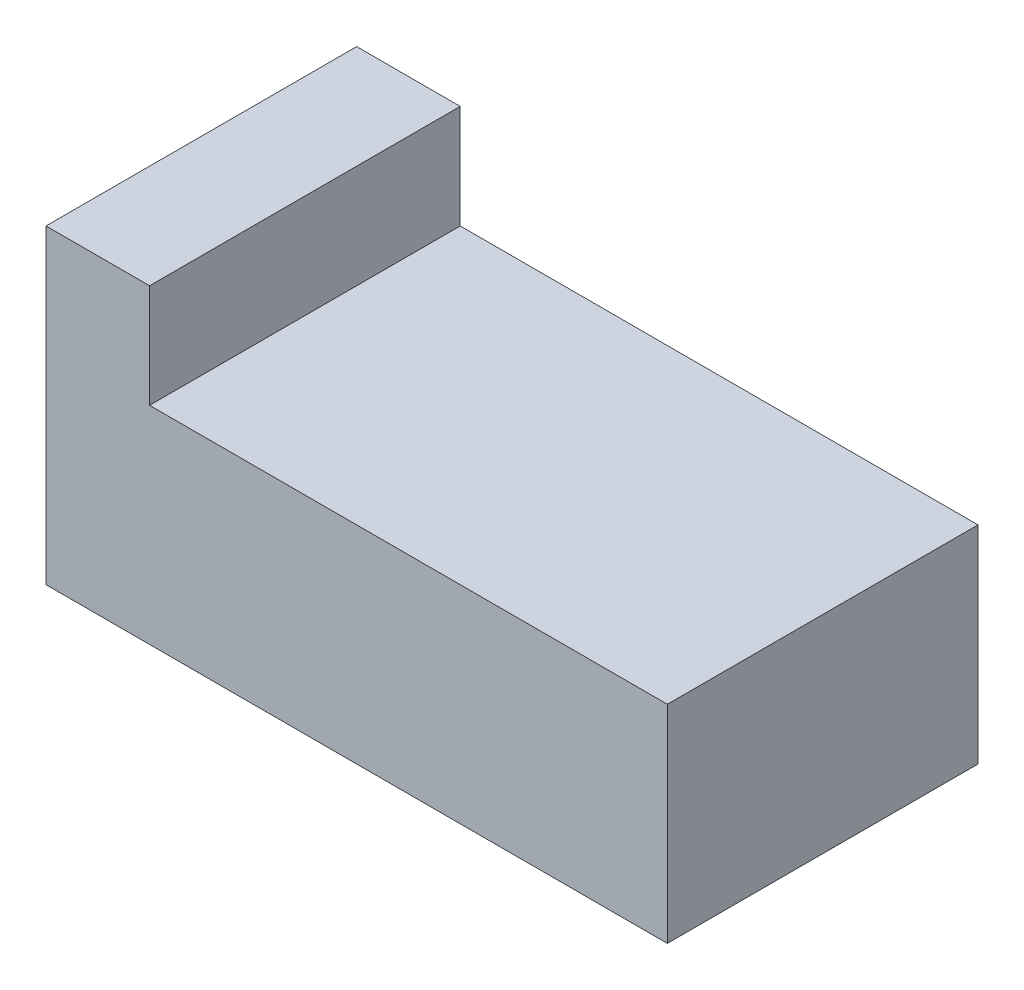
ISO-10303-21;
HEADER;
FILE_DESCRIPTION(('STEP AP214'),'2;1');
FILE_NAME('part.step','',(''),(''),'','','');
FILE_SCHEMA(('AUTOMOTIVE_DESIGN { 1 0 10303 214 1 1 1 1 }'));
ENDSEC;
DATA;
#1=APPLICATION_CONTEXT('core data for automotive mechanical design processes');
#2=APPLICATION_PROTOCOL_DEFINITION('international standard','automotive_design',2000,#1);
#3=PRODUCT_CONTEXT('',#1,'mechanical');
#4=PRODUCT('Part','Part','',(#3));
#5=PRODUCT_RELATED_PRODUCT_CATEGORY('part','',(#4));
#6=PRODUCT_DEFINITION_FORMATION('','',#4);
#7=PRODUCT_DEFINITION_CONTEXT('part definition',#1,'design');
#8=PRODUCT_DEFINITION('design','',#6,#7);
#9=PRODUCT_DEFINITION_SHAPE('','',#8);
#10=(LENGTH_UNIT() NAMED_UNIT(*) SI_UNIT(.MILLI.,.METRE.));
#11=(NAMED_UNIT(*) PLANE_ANGLE_UNIT() SI_UNIT($,.RADIAN.));
#12=(NAMED_UNIT(*) SI_UNIT($,.STERADIAN.) SOLID_ANGLE_UNIT());
#13=UNCERTAINTY_MEASURE_WITH_UNIT(LENGTH_MEASURE(1.E-05),#10,'distance_accuracy_value','');
#14=(GEOMETRIC_REPRESENTATION_CONTEXT(3) GLOBAL_UNCERTAINTY_ASSIGNED_CONTEXT((#13)) GLOBAL_UNIT_ASSIGNED_CONTEXT((#10,
#11,#12)) REPRESENTATION_CONTEXT('',''));
#15=CARTESIAN_POINT('',(0.,0.,0.));
#16=DIRECTION('',(0.,0.,1.));
#17=DIRECTION('',(1.,0.,0.));
#18=AXIS2_PLACEMENT_3D('',#15,#16,#17);
#19=CARTESIAN_POINT('',(0.,30.,0.));
#20=DIRECTION('',(0.,1.,0.));
#21=DIRECTION('',(0.,0.,1.));
#22=AXIS2_PLACEMENT_3D('',#19,#20,#21);
#23=PLANE('',#22);
#24=DIRECTION('',(-1.,0.,0.));
#25=VECTOR('',#24,1.);
#26=CARTESIAN_POINT('',(0.,30.,0.));
#27=LINE('',#26,#25);
#28=CARTESIAN_POINT('',(0.,30.,0.));
#29=VERTEX_POINT('',#28);
#30=CARTESIAN_POINT('',(10.,30.,0.));
#31=VERTEX_POINT('',#30);
#32=EDGE_CURVE('E101',#29,#31,#27,.F.);
#33=ORIENTED_EDGE('',*,*,#32,.F.);
#34=DIRECTION('',(0.,0.,-1.));
#35=VECTOR('',#34,1.);
#36=CARTESIAN_POINT('',(0.,30.,30.));
#37=LINE('',#36,#35);
#38=CARTESIAN_POINT('',(0.,30.,30.));
#39=VERTEX_POINT('',#38);
#40=EDGE_CURVE('E86',#29,#39,#37,.F.);
#41=ORIENTED_EDGE('',*,*,#40,.T.);
#42=DIRECTION('',(-1.,0.,0.));
#43=VECTOR('',#42,1.);
#44=CARTESIAN_POINT('',(0.,30.,30.));
#45=LINE('',#44,#43);
#46=CARTESIAN_POINT('',(10.,30.,30.));
#47=VERTEX_POINT('',#46);
#48=EDGE_CURVE('E66',#39,#47,#45,.F.);
#49=ORIENTED_EDGE('',*,*,#48,.T.);
#50=DIRECTION('',(0.,0.,1.));
#51=VECTOR('',#50,1.);
#52=CARTESIAN_POINT('',(10.,30.,0.));
#53=LINE('',#52,#51);
#54=EDGE_CURVE('E20',#47,#31,#53,.F.);
#55=ORIENTED_EDGE('',*,*,#54,.T.);
#56=EDGE_LOOP('',(#33,#41,#49,#55));
#57=FACE_BOUND('',#56,.T.);
#58=ADVANCED_FACE('F17',(#57),#23,.T.);
#59=CARTESIAN_POINT('',(10.,30.,0.));
#60=DIRECTION('',(-1.,0.,0.));
#61=DIRECTION('',(0.,0.,1.));
#62=AXIS2_PLACEMENT_3D('',#59,#60,#61);
#63=PLANE('',#62);
#64=DIRECTION('',(0.,1.,0.));
#65=VECTOR('',#64,1.);
#66=CARTESIAN_POINT('',(10.,0.,0.));
#67=LINE('',#66,#65);
#68=CARTESIAN_POINT('',(10.,20.,0.));
#69=VERTEX_POINT('',#68);
#70=EDGE_CURVE('E76',#31,#69,#67,.F.);
#71=ORIENTED_EDGE('',*,*,#70,.F.);
#72=ORIENTED_EDGE('',*,*,#54,.F.);
#73=DIRECTION('',(0.,1.,0.));
#74=VECTOR('',#73,1.);
#75=CARTESIAN_POINT('',(10.,0.,30.));
#76=LINE('',#75,#74);
#77=CARTESIAN_POINT('',(10.,20.,30.));
#78=VERTEX_POINT('',#77);
#79=EDGE_CURVE('E75',#47,#78,#76,.F.);
#80=ORIENTED_EDGE('',*,*,#79,.T.);
#81=DIRECTION('',(0.,0.,-1.));
#82=VECTOR('',#81,1.);
#83=CARTESIAN_POINT('',(10.,20.,30.));
#84=LINE('',#83,#82);
#85=EDGE_CURVE('E79',#78,#69,#84,.T.);
#86=ORIENTED_EDGE('',*,*,#85,.T.);
#87=EDGE_LOOP('',(#71,#72,#80,#86));
#88=FACE_BOUND('',#87,.T.);
#89=ADVANCED_FACE('F73',(#88),#63,.F.);
#90=CARTESIAN_POINT('',(0.,20.,30.));
#91=DIRECTION('',(0.,-1.,0.));
#92=DIRECTION('',(0.,0.,-1.));
#93=AXIS2_PLACEMENT_3D('',#90,#91,#92);
#94=PLANE('',#93);
#95=DIRECTION('',(-1.,0.,0.));
#96=VECTOR('',#95,1.);
#97=CARTESIAN_POINT('',(0.,20.,30.));
#98=LINE('',#97,#96);
#99=CARTESIAN_POINT('',(60.,20.,30.));
#100=VERTEX_POINT('',#99);
#101=EDGE_CURVE('E84',#78,#100,#98,.F.);
#102=ORIENTED_EDGE('',*,*,#101,.T.);
#103=DIRECTION('',(0.,0.,1.));
#104=VECTOR('',#103,1.);
#105=CARTESIAN_POINT('',(60.,20.,30.));
#106=LINE('',#105,#104);
#107=CARTESIAN_POINT('',(60.,20.,0.));
#108=VERTEX_POINT('',#107);
#109=EDGE_CURVE('E97',#100,#108,#106,.F.);
#110=ORIENTED_EDGE('',*,*,#109,.T.);
#111=DIRECTION('',(-1.,0.,0.));
#112=VECTOR('',#111,1.);
#113=CARTESIAN_POINT('',(0.,20.,0.));
#114=LINE('',#113,#112);
#115=EDGE_CURVE('E94',#69,#108,#114,.F.);
#116=ORIENTED_EDGE('',*,*,#115,.F.);
#117=ORIENTED_EDGE('',*,*,#85,.F.);
#118=EDGE_LOOP('',(#102,#110,#116,#117));
#119=FACE_BOUND('',#118,.T.);
#120=ADVANCED_FACE('F95',(#119),#94,.F.);
#121=CARTESIAN_POINT('',(0.,0.,30.));
#122=DIRECTION('',(1.,0.,0.));
#123=DIRECTION('',(0.,0.,-1.));
#124=AXIS2_PLACEMENT_3D('',#121,#122,#123);
#125=PLANE('',#124);
#126=DIRECTION('',(0.,0.,1.));
#127=VECTOR('',#126,1.);
#128=CARTESIAN_POINT('',(0.,0.,30.));
#129=LINE('',#128,#127);
#130=CARTESIAN_POINT('',(0.,0.,0.));
#131=VERTEX_POINT('',#130);
#132=CARTESIAN_POINT('',(0.,0.,30.));
#133=VERTEX_POINT('',#132);
#134=EDGE_CURVE('E99',#131,#133,#129,.T.);
#135=ORIENTED_EDGE('',*,*,#134,.T.);
#136=DIRECTION('',(0.,1.,0.));
#137=VECTOR('',#136,1.);
#138=CARTESIAN_POINT('',(0.,0.,30.));
#139=LINE('',#138,#137);
#140=EDGE_CURVE('E112',#133,#39,#139,.T.);
#141=ORIENTED_EDGE('',*,*,#140,.T.);
#142=ORIENTED_EDGE('',*,*,#40,.F.);
#143=DIRECTION('',(0.,1.,0.));
#144=VECTOR('',#143,1.);
#145=CARTESIAN_POINT('',(0.,0.,0.));
#146=LINE('',#145,#144);
#147=EDGE_CURVE('E106',#131,#29,#146,.T.);
#148=ORIENTED_EDGE('',*,*,#147,.F.);
#149=EDGE_LOOP('',(#135,#141,#142,#148));
#150=FACE_BOUND('',#149,.T.);
#151=ADVANCED_FACE('F125',(#150),#125,.F.);
#152=CARTESIAN_POINT('',(0.,0.,30.));
#153=DIRECTION('',(0.,0.,-1.));
#154=DIRECTION('',(-1.,0.,0.));
#155=AXIS2_PLACEMENT_3D('',#152,#153,#154);
#156=PLANE('',#155);
#157=DIRECTION('',(1.,0.,0.));
#158=VECTOR('',#157,1.);
#159=CARTESIAN_POINT('',(0.,0.,30.));
#160=LINE('',#159,#158);
#161=CARTESIAN_POINT('',(60.,0.,30.));
#162=VERTEX_POINT('',#161);
#163=EDGE_CURVE('E118',#133,#162,#160,.T.);
#164=ORIENTED_EDGE('',*,*,#163,.T.);
#165=DIRECTION('',(0.,1.,0.));
#166=VECTOR('',#165,1.);
#167=CARTESIAN_POINT('',(60.,0.,30.));
#168=LINE('',#167,#166);
#169=EDGE_CURVE('E110',#162,#100,#168,.T.);
#170=ORIENTED_EDGE('',*,*,#169,.T.);
#171=ORIENTED_EDGE('',*,*,#101,.F.);
#172=ORIENTED_EDGE('',*,*,#79,.F.);
#173=ORIENTED_EDGE('',*,*,#48,.F.);
#174=ORIENTED_EDGE('',*,*,#140,.F.);
#175=EDGE_LOOP('',(#164,#170,#171,#172,#173,#174));
#176=FACE_BOUND('',#175,.T.);
#177=ADVANCED_FACE('F82',(#176),#156,.F.);
#178=CARTESIAN_POINT('',(60.,0.,30.));
#179=DIRECTION('',(-1.,0.,0.));
#180=DIRECTION('',(0.,0.,1.));
#181=AXIS2_PLACEMENT_3D('',#178,#179,#180);
#182=PLANE('',#181);
#183=ORIENTED_EDGE('',*,*,#109,.F.);
#184=ORIENTED_EDGE('',*,*,#169,.F.);
#185=DIRECTION('',(0.,0.,1.));
#186=VECTOR('',#185,1.);
#187=CARTESIAN_POINT('',(60.,0.,30.));
#188=LINE('',#187,#186);
#189=CARTESIAN_POINT('',(60.,0.,0.));
#190=VERTEX_POINT('',#189);
#191=EDGE_CURVE('E26',#162,#190,#188,.F.);
#192=ORIENTED_EDGE('',*,*,#191,.T.);
#193=DIRECTION('',(0.,1.,0.));
#194=VECTOR('',#193,1.);
#195=CARTESIAN_POINT('',(60.,0.,0.));
#196=LINE('',#195,#194);
#197=EDGE_CURVE('E34',#108,#190,#196,.F.);
#198=ORIENTED_EDGE('',*,*,#197,.F.);
#199=EDGE_LOOP('',(#183,#184,#192,#198));
#200=FACE_BOUND('',#199,.T.);
#201=ADVANCED_FACE('F114',(#200),#182,.F.);
#202=CARTESIAN_POINT('',(0.,0.,0.));
#203=DIRECTION('',(0.,0.,-1.));
#204=DIRECTION('',(-1.,0.,0.));
#205=AXIS2_PLACEMENT_3D('',#202,#203,#204);
#206=PLANE('',#205);
#207=ORIENTED_EDGE('',*,*,#197,.T.);
#208=DIRECTION('',(1.,0.,0.));
#209=VECTOR('',#208,1.);
#210=CARTESIAN_POINT('',(0.,0.,0.));
#211=LINE('',#210,#209);
#212=EDGE_CURVE('E11',#190,#131,#211,.F.);
#213=ORIENTED_EDGE('',*,*,#212,.T.);
#214=ORIENTED_EDGE('',*,*,#147,.T.);
#215=ORIENTED_EDGE('',*,*,#32,.T.);
#216=ORIENTED_EDGE('',*,*,#70,.T.);
#217=ORIENTED_EDGE('',*,*,#115,.T.);
#218=EDGE_LOOP('',(#207,#213,#214,#215,#216,#217));
#219=FACE_BOUND('',#218,.T.);
#220=ADVANCED_FACE('F127',(#219),#206,.T.);
#221=CARTESIAN_POINT('',(0.,0.,30.));
#222=DIRECTION('',(0.,1.,0.));
#223=DIRECTION('',(0.,0.,1.));
#224=AXIS2_PLACEMENT_3D('',#221,#222,#223);
#225=PLANE('',#224);
#226=ORIENTED_EDGE('',*,*,#191,.F.);
#227=ORIENTED_EDGE('',*,*,#163,.F.);
#228=ORIENTED_EDGE('',*,*,#134,.F.);
#229=ORIENTED_EDGE('',*,*,#212,.F.);
#230=EDGE_LOOP('',(#226,#227,#228,#229));
#231=FACE_BOUND('',#230,.T.);
#232=ADVANCED_FACE('F126',(#231),#225,.F.);
#233=CLOSED_SHELL('',(#58,#89,#120,#151,#177,#201,#220,#232));
#234=MANIFOLD_SOLID_BREP('B1',#233);
#235=ADVANCED_BREP_SHAPE_REPRESENTATION('',(#18,#234),#14);
#236=SHAPE_DEFINITION_REPRESENTATION(#9,#235);
ENDSEC;
END-ISO-10303-21;
